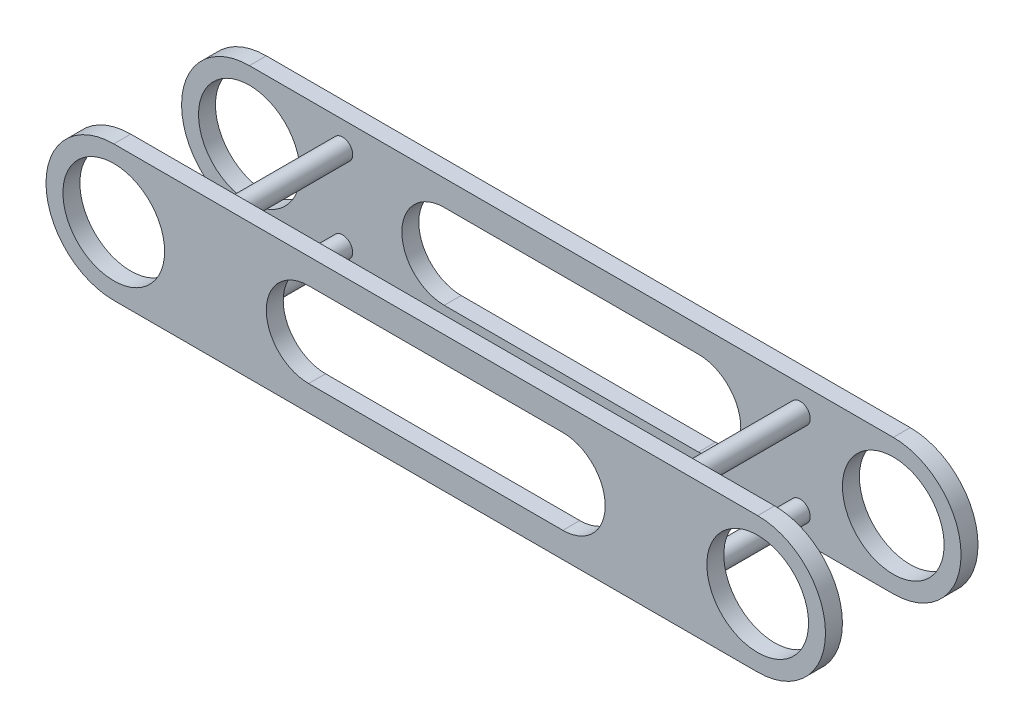
ISO-10303-21;
HEADER;
FILE_DESCRIPTION(('STEP AP214'),'2;1');
FILE_NAME('part.step','',(''),(''),'','','');
FILE_SCHEMA(('AUTOMOTIVE_DESIGN { 1 0 10303 214 1 1 1 1 }'));
ENDSEC;
DATA;
#1=APPLICATION_CONTEXT('core data for automotive mechanical design processes');
#2=APPLICATION_PROTOCOL_DEFINITION('international standard','automotive_design',2000,#1);
#3=PRODUCT_CONTEXT('',#1,'mechanical');
#4=PRODUCT('Part','Part','',(#3));
#5=PRODUCT_RELATED_PRODUCT_CATEGORY('part','',(#4));
#6=PRODUCT_DEFINITION_FORMATION('','',#4);
#7=PRODUCT_DEFINITION_CONTEXT('part definition',#1,'design');
#8=PRODUCT_DEFINITION('design','',#6,#7);
#9=PRODUCT_DEFINITION_SHAPE('','',#8);
#10=(LENGTH_UNIT() NAMED_UNIT(*) SI_UNIT(.MILLI.,.METRE.));
#11=(NAMED_UNIT(*) PLANE_ANGLE_UNIT() SI_UNIT($,.RADIAN.));
#12=(NAMED_UNIT(*) SI_UNIT($,.STERADIAN.) SOLID_ANGLE_UNIT());
#13=UNCERTAINTY_MEASURE_WITH_UNIT(LENGTH_MEASURE(1.E-05),#10,'distance_accuracy_value','');
#14=(GEOMETRIC_REPRESENTATION_CONTEXT(3) GLOBAL_UNCERTAINTY_ASSIGNED_CONTEXT((#13)) GLOBAL_UNIT_ASSIGNED_CONTEXT((#10,
#11,#12)) REPRESENTATION_CONTEXT('',''));
#15=CARTESIAN_POINT('',(0.,0.,0.));
#16=DIRECTION('',(0.,0.,1.));
#17=DIRECTION('',(1.,0.,0.));
#18=AXIS2_PLACEMENT_3D('',#15,#16,#17);
#19=CARTESIAN_POINT('',(380.,0.,-35.));
#20=DIRECTION('',(0.,0.,-1.));
#21=DIRECTION('',(1.,0.,0.));
#22=AXIS2_PLACEMENT_3D('',#19,#20,#21);
#23=PLANE('',#22);
#24=CARTESIAN_POINT('',(54.9999999999999,-25.,-35.));
#25=DIRECTION('',(0.,0.,-1.));
#26=DIRECTION('',(-1.,0.,0.));
#27=AXIS2_PLACEMENT_3D('',#24,#25,#26);
#28=CIRCLE('',#27,6.);
#29=CARTESIAN_POINT('',(48.9999999999999,-25.,-35.));
#30=VERTEX_POINT('',#29);
#31=EDGE_CURVE('E443',#30,#30,#28,.F.);
#32=ORIENTED_EDGE('',*,*,#31,.F.);
#33=EDGE_LOOP('',(#32));
#34=FACE_BOUND('',#33,.T.);
#35=CARTESIAN_POINT('',(325.,-25.,-35.));
#36=DIRECTION('',(0.,0.,-1.));
#37=DIRECTION('',(-1.,0.,0.));
#38=AXIS2_PLACEMENT_3D('',#35,#36,#37);
#39=CIRCLE('',#38,5.99999999999999);
#40=CARTESIAN_POINT('',(319.,-25.,-35.));
#41=VERTEX_POINT('',#40);
#42=EDGE_CURVE('E449',#41,#41,#39,.F.);
#43=ORIENTED_EDGE('',*,*,#42,.F.);
#44=EDGE_LOOP('',(#43));
#45=FACE_BOUND('',#44,.T.);
#46=CARTESIAN_POINT('',(325.,25.,-35.));
#47=DIRECTION('',(0.,0.,-1.));
#48=DIRECTION('',(-1.,0.,0.));
#49=AXIS2_PLACEMENT_3D('',#46,#47,#48);
#50=CIRCLE('',#49,5.99999999999999);
#51=CARTESIAN_POINT('',(319.,25.,-35.));
#52=VERTEX_POINT('',#51);
#53=EDGE_CURVE('E444',#52,#52,#50,.F.);
#54=ORIENTED_EDGE('',*,*,#53,.F.);
#55=EDGE_LOOP('',(#54));
#56=FACE_BOUND('',#55,.T.);
#57=CARTESIAN_POINT('',(54.9999999999999,25.,-35.));
#58=DIRECTION('',(0.,0.,-1.));
#59=DIRECTION('',(-1.,0.,0.));
#60=AXIS2_PLACEMENT_3D('',#57,#58,#59);
#61=CIRCLE('',#60,6.);
#62=CARTESIAN_POINT('',(48.9999999999999,25.,-35.));
#63=VERTEX_POINT('',#62);
#64=EDGE_CURVE('E448',#63,#63,#61,.F.);
#65=ORIENTED_EDGE('',*,*,#64,.F.);
#66=EDGE_LOOP('',(#65));
#67=FACE_BOUND('',#66,.T.);
#68=CARTESIAN_POINT('',(380.,0.,-35.));
#69=DIRECTION('',(0.,0.,1.));
#70=DIRECTION('',(1.,0.,0.));
#71=AXIS2_PLACEMENT_3D('',#68,#69,#70);
#72=CIRCLE('',#71,40.);
#73=CARTESIAN_POINT('',(380.,-40.,-35.));
#74=VERTEX_POINT('',#73);
#75=CARTESIAN_POINT('',(380.,40.,-35.));
#76=VERTEX_POINT('',#75);
#77=EDGE_CURVE('E208',#74,#76,#72,.T.);
#78=ORIENTED_EDGE('',*,*,#77,.T.);
#79=DIRECTION('',(-1.,0.,0.));
#80=VECTOR('',#79,1.);
#81=CARTESIAN_POINT('',(0.,40.,-35.));
#82=LINE('',#81,#80);
#83=CARTESIAN_POINT('',(0.,40.,-35.));
#84=VERTEX_POINT('',#83);
#85=EDGE_CURVE('E219',#76,#84,#82,.T.);
#86=ORIENTED_EDGE('',*,*,#85,.T.);
#87=CARTESIAN_POINT('',(0.,0.,-35.));
#88=DIRECTION('',(0.,0.,1.));
#89=DIRECTION('',(1.,0.,0.));
#90=AXIS2_PLACEMENT_3D('',#87,#88,#89);
#91=CIRCLE('',#90,40.);
#92=CARTESIAN_POINT('',(0.,-40.,-35.));
#93=VERTEX_POINT('',#92);
#94=EDGE_CURVE('E216',#84,#93,#91,.T.);
#95=ORIENTED_EDGE('',*,*,#94,.T.);
#96=DIRECTION('',(1.,0.,0.));
#97=VECTOR('',#96,1.);
#98=CARTESIAN_POINT('',(0.,-40.,-35.));
#99=LINE('',#98,#97);
#100=EDGE_CURVE('E212',#93,#74,#99,.T.);
#101=ORIENTED_EDGE('',*,*,#100,.T.);
#102=EDGE_LOOP('',(#78,#86,#95,#101));
#103=FACE_BOUND('',#102,.T.);
#104=CARTESIAN_POINT('',(380.,0.,-35.));
#105=DIRECTION('',(0.,0.,-1.));
#106=DIRECTION('',(-1.,0.,0.));
#107=AXIS2_PLACEMENT_3D('',#104,#105,#106);
#108=CIRCLE('',#107,30.);
#109=CARTESIAN_POINT('',(350.,0.,-35.));
#110=VERTEX_POINT('',#109);
#111=EDGE_CURVE('E424',#110,#110,#108,.T.);
#112=ORIENTED_EDGE('',*,*,#111,.T.);
#113=EDGE_LOOP('',(#112));
#114=FACE_BOUND('',#113,.T.);
#115=CARTESIAN_POINT('',(0.,0.,-35.));
#116=DIRECTION('',(0.,0.,-1.));
#117=DIRECTION('',(-1.,0.,0.));
#118=AXIS2_PLACEMENT_3D('',#115,#116,#117);
#119=CIRCLE('',#118,30.);
#120=CARTESIAN_POINT('',(-30.,0.,-35.));
#121=VERTEX_POINT('',#120);
#122=EDGE_CURVE('E439',#121,#121,#119,.T.);
#123=ORIENTED_EDGE('',*,*,#122,.T.);
#124=EDGE_LOOP('',(#123));
#125=FACE_BOUND('',#124,.T.);
#126=CARTESIAN_POINT('',(265.,0.,-35.));
#127=DIRECTION('',(0.,0.,-1.));
#128=DIRECTION('',(-1.,0.,0.));
#129=AXIS2_PLACEMENT_3D('',#126,#127,#128);
#130=CIRCLE('',#129,25.);
#131=CARTESIAN_POINT('',(265.,-25.,-35.));
#132=VERTEX_POINT('',#131);
#133=CARTESIAN_POINT('',(265.,25.,-35.));
#134=VERTEX_POINT('',#133);
#135=EDGE_CURVE('E204',#132,#134,#130,.F.);
#136=ORIENTED_EDGE('',*,*,#135,.F.);
#137=DIRECTION('',(1.,0.,0.));
#138=VECTOR('',#137,1.);
#139=CARTESIAN_POINT('',(380.,-25.,-35.));
#140=LINE('',#139,#138);
#141=CARTESIAN_POINT('',(115.,-25.,-35.));
#142=VERTEX_POINT('',#141);
#143=EDGE_CURVE('E192',#142,#132,#140,.T.);
#144=ORIENTED_EDGE('',*,*,#143,.F.);
#145=CARTESIAN_POINT('',(115.,0.,-35.));
#146=DIRECTION('',(0.,0.,-1.));
#147=DIRECTION('',(-1.,0.,0.));
#148=AXIS2_PLACEMENT_3D('',#145,#146,#147);
#149=CIRCLE('',#148,25.);
#150=CARTESIAN_POINT('',(115.,25.,-35.));
#151=VERTEX_POINT('',#150);
#152=EDGE_CURVE('E168',#151,#142,#149,.F.);
#153=ORIENTED_EDGE('',*,*,#152,.F.);
#154=DIRECTION('',(-1.,0.,0.));
#155=VECTOR('',#154,1.);
#156=CARTESIAN_POINT('',(380.,25.,-35.));
#157=LINE('',#156,#155);
#158=EDGE_CURVE('E201',#134,#151,#157,.T.);
#159=ORIENTED_EDGE('',*,*,#158,.F.);
#160=EDGE_LOOP('',(#136,#144,#153,#159));
#161=FACE_BOUND('',#160,.T.);
#162=ADVANCED_FACE('F47',(#34,#45,#56,#67,#103,#114,#125,#161),#23,.F.);
#163=CARTESIAN_POINT('',(380.,0.,-45.));
#164=DIRECTION('',(0.,0.,-1.));
#165=DIRECTION('',(1.,0.,0.));
#166=AXIS2_PLACEMENT_3D('',#163,#164,#165);
#167=PLANE('',#166);
#168=CARTESIAN_POINT('',(0.,0.,-45.));
#169=DIRECTION('',(0.,0.,-1.));
#170=DIRECTION('',(-1.,0.,0.));
#171=AXIS2_PLACEMENT_3D('',#168,#169,#170);
#172=CIRCLE('',#171,30.);
#173=CARTESIAN_POINT('',(-30.,0.,-45.));
#174=VERTEX_POINT('',#173);
#175=EDGE_CURVE('E429',#174,#174,#172,.T.);
#176=ORIENTED_EDGE('',*,*,#175,.F.);
#177=EDGE_LOOP('',(#176));
#178=FACE_BOUND('',#177,.T.);
#179=CARTESIAN_POINT('',(380.,0.,-45.));
#180=DIRECTION('',(0.,0.,-1.));
#181=DIRECTION('',(-1.,0.,0.));
#182=AXIS2_PLACEMENT_3D('',#179,#180,#181);
#183=CIRCLE('',#182,30.);
#184=CARTESIAN_POINT('',(350.,0.,-45.));
#185=VERTEX_POINT('',#184);
#186=EDGE_CURVE('E432',#185,#185,#183,.T.);
#187=ORIENTED_EDGE('',*,*,#186,.F.);
#188=EDGE_LOOP('',(#187));
#189=FACE_BOUND('',#188,.T.);
#190=CARTESIAN_POINT('',(380.,0.,-45.));
#191=DIRECTION('',(0.,0.,1.));
#192=DIRECTION('',(1.,0.,0.));
#193=AXIS2_PLACEMENT_3D('',#190,#191,#192);
#194=CIRCLE('',#193,40.);
#195=CARTESIAN_POINT('',(380.,-40.,-45.));
#196=VERTEX_POINT('',#195);
#197=CARTESIAN_POINT('',(380.,40.,-45.));
#198=VERTEX_POINT('',#197);
#199=EDGE_CURVE('E207',#196,#198,#194,.T.);
#200=ORIENTED_EDGE('',*,*,#199,.F.);
#201=DIRECTION('',(1.,0.,0.));
#202=VECTOR('',#201,1.);
#203=CARTESIAN_POINT('',(0.,-40.,-45.));
#204=LINE('',#203,#202);
#205=CARTESIAN_POINT('',(0.,-40.,-45.));
#206=VERTEX_POINT('',#205);
#207=EDGE_CURVE('E226',#206,#196,#204,.T.);
#208=ORIENTED_EDGE('',*,*,#207,.F.);
#209=CARTESIAN_POINT('',(0.,0.,-45.));
#210=DIRECTION('',(0.,0.,1.));
#211=DIRECTION('',(1.,0.,0.));
#212=AXIS2_PLACEMENT_3D('',#209,#210,#211);
#213=CIRCLE('',#212,40.);
#214=CARTESIAN_POINT('',(0.,40.,-45.));
#215=VERTEX_POINT('',#214);
#216=EDGE_CURVE('E229',#215,#206,#213,.T.);
#217=ORIENTED_EDGE('',*,*,#216,.F.);
#218=DIRECTION('',(-1.,0.,0.));
#219=VECTOR('',#218,1.);
#220=CARTESIAN_POINT('',(0.,40.,-45.));
#221=LINE('',#220,#219);
#222=EDGE_CURVE('E213',#198,#215,#221,.T.);
#223=ORIENTED_EDGE('',*,*,#222,.F.);
#224=EDGE_LOOP('',(#200,#208,#217,#223));
#225=FACE_BOUND('',#224,.T.);
#226=DIRECTION('',(1.,0.,0.));
#227=VECTOR('',#226,1.);
#228=CARTESIAN_POINT('',(265.,-25.,-45.));
#229=LINE('',#228,#227);
#230=CARTESIAN_POINT('',(115.,-25.,-45.));
#231=VERTEX_POINT('',#230);
#232=CARTESIAN_POINT('',(265.,-25.,-45.));
#233=VERTEX_POINT('',#232);
#234=EDGE_CURVE('E175',#231,#233,#229,.T.);
#235=ORIENTED_EDGE('',*,*,#234,.T.);
#236=CARTESIAN_POINT('',(265.,0.,-45.));
#237=DIRECTION('',(0.,0.,1.));
#238=DIRECTION('',(1.,0.,0.));
#239=AXIS2_PLACEMENT_3D('',#236,#237,#238);
#240=CIRCLE('',#239,25.);
#241=CARTESIAN_POINT('',(265.,25.,-45.));
#242=VERTEX_POINT('',#241);
#243=EDGE_CURVE('E73',#233,#242,#240,.T.);
#244=ORIENTED_EDGE('',*,*,#243,.T.);
#245=DIRECTION('',(-1.,0.,0.));
#246=VECTOR('',#245,1.);
#247=CARTESIAN_POINT('',(265.,25.,-45.));
#248=LINE('',#247,#246);
#249=CARTESIAN_POINT('',(115.,25.,-45.));
#250=VERTEX_POINT('',#249);
#251=EDGE_CURVE('E182',#242,#250,#248,.T.);
#252=ORIENTED_EDGE('',*,*,#251,.T.);
#253=CARTESIAN_POINT('',(115.,0.,-45.));
#254=DIRECTION('',(0.,0.,1.));
#255=DIRECTION('',(1.,0.,0.));
#256=AXIS2_PLACEMENT_3D('',#253,#254,#255);
#257=CIRCLE('',#256,25.);
#258=EDGE_CURVE('E165',#250,#231,#257,.T.);
#259=ORIENTED_EDGE('',*,*,#258,.T.);
#260=EDGE_LOOP('',(#235,#244,#252,#259));
#261=FACE_BOUND('',#260,.T.);
#262=ADVANCED_FACE('F180',(#178,#189,#225,#261),#167,.T.);
#263=CARTESIAN_POINT('',(380.,0.,35.));
#264=DIRECTION('',(0.,0.,1.));
#265=DIRECTION('',(1.,0.,0.));
#266=AXIS2_PLACEMENT_3D('',#263,#264,#265);
#267=CYLINDRICAL_SURFACE('',#266,40.);
#268=CARTESIAN_POINT('',(380.,0.,45.));
#269=DIRECTION('',(0.,0.,1.));
#270=DIRECTION('',(1.,0.,0.));
#271=AXIS2_PLACEMENT_3D('',#268,#269,#270);
#272=CIRCLE('',#271,40.);
#273=CARTESIAN_POINT('',(380.,-40.,45.));
#274=VERTEX_POINT('',#273);
#275=CARTESIAN_POINT('',(380.,40.,45.));
#276=VERTEX_POINT('',#275);
#277=EDGE_CURVE('E293',#274,#276,#272,.T.);
#278=ORIENTED_EDGE('',*,*,#277,.F.);
#279=DIRECTION('',(0.,0.,1.));
#280=VECTOR('',#279,1.);
#281=CARTESIAN_POINT('',(380.,-40.,35.));
#282=LINE('',#281,#280);
#283=CARTESIAN_POINT('',(380.,-40.,35.));
#284=VERTEX_POINT('',#283);
#285=EDGE_CURVE('E11',#284,#274,#282,.T.);
#286=ORIENTED_EDGE('',*,*,#285,.F.);
#287=CARTESIAN_POINT('',(380.,0.,35.));
#288=DIRECTION('',(0.,0.,1.));
#289=DIRECTION('',(1.,0.,0.));
#290=AXIS2_PLACEMENT_3D('',#287,#288,#289);
#291=CIRCLE('',#290,40.);
#292=CARTESIAN_POINT('',(380.,40.,35.));
#293=VERTEX_POINT('',#292);
#294=EDGE_CURVE('E294',#284,#293,#291,.T.);
#295=ORIENTED_EDGE('',*,*,#294,.T.);
#296=DIRECTION('',(0.,0.,1.));
#297=VECTOR('',#296,1.);
#298=CARTESIAN_POINT('',(380.,40.,35.));
#299=LINE('',#298,#297);
#300=EDGE_CURVE('E51',#293,#276,#299,.T.);
#301=ORIENTED_EDGE('',*,*,#300,.T.);
#302=EDGE_LOOP('',(#278,#286,#295,#301));
#303=FACE_BOUND('',#302,.T.);
#304=ADVANCED_FACE('F49',(#303),#267,.T.);
#305=CARTESIAN_POINT('',(0.,-40.,35.));
#306=DIRECTION('',(0.,-1.,0.));
#307=DIRECTION('',(0.,0.,-1.));
#308=AXIS2_PLACEMENT_3D('',#305,#306,#307);
#309=PLANE('',#308);
#310=DIRECTION('',(1.,0.,0.));
#311=VECTOR('',#310,1.);
#312=CARTESIAN_POINT('',(0.,-40.,45.));
#313=LINE('',#312,#311);
#314=CARTESIAN_POINT('',(0.,-40.,45.));
#315=VERTEX_POINT('',#314);
#316=EDGE_CURVE('E299',#315,#274,#313,.T.);
#317=ORIENTED_EDGE('',*,*,#316,.F.);
#318=DIRECTION('',(0.,0.,1.));
#319=VECTOR('',#318,1.);
#320=CARTESIAN_POINT('',(0.,-40.,35.));
#321=LINE('',#320,#319);
#322=CARTESIAN_POINT('',(0.,-40.,35.));
#323=VERTEX_POINT('',#322);
#324=EDGE_CURVE('E57',#323,#315,#321,.T.);
#325=ORIENTED_EDGE('',*,*,#324,.F.);
#326=DIRECTION('',(1.,0.,0.));
#327=VECTOR('',#326,1.);
#328=CARTESIAN_POINT('',(0.,-40.,35.));
#329=LINE('',#328,#327);
#330=EDGE_CURVE('E307',#323,#284,#329,.T.);
#331=ORIENTED_EDGE('',*,*,#330,.T.);
#332=ORIENTED_EDGE('',*,*,#285,.T.);
#333=EDGE_LOOP('',(#317,#325,#331,#332));
#334=FACE_BOUND('',#333,.T.);
#335=ADVANCED_FACE('F341',(#334),#309,.T.);
#336=CARTESIAN_POINT('',(0.,0.,35.));
#337=DIRECTION('',(0.,0.,1.));
#338=DIRECTION('',(1.,0.,0.));
#339=AXIS2_PLACEMENT_3D('',#336,#337,#338);
#340=CYLINDRICAL_SURFACE('',#339,40.);
#341=CARTESIAN_POINT('',(0.,0.,45.));
#342=DIRECTION('',(0.,0.,1.));
#343=DIRECTION('',(1.,0.,0.));
#344=AXIS2_PLACEMENT_3D('',#341,#342,#343);
#345=CIRCLE('',#344,40.);
#346=CARTESIAN_POINT('',(0.,40.,45.));
#347=VERTEX_POINT('',#346);
#348=EDGE_CURVE('E318',#347,#315,#345,.T.);
#349=ORIENTED_EDGE('',*,*,#348,.F.);
#350=DIRECTION('',(0.,0.,1.));
#351=VECTOR('',#350,1.);
#352=CARTESIAN_POINT('',(0.,40.,35.));
#353=LINE('',#352,#351);
#354=CARTESIAN_POINT('',(0.,40.,35.));
#355=VERTEX_POINT('',#354);
#356=EDGE_CURVE('E326',#355,#347,#353,.T.);
#357=ORIENTED_EDGE('',*,*,#356,.F.);
#358=CARTESIAN_POINT('',(0.,0.,35.));
#359=DIRECTION('',(0.,0.,1.));
#360=DIRECTION('',(1.,0.,0.));
#361=AXIS2_PLACEMENT_3D('',#358,#359,#360);
#362=CIRCLE('',#361,40.);
#363=EDGE_CURVE('E303',#355,#323,#362,.T.);
#364=ORIENTED_EDGE('',*,*,#363,.T.);
#365=ORIENTED_EDGE('',*,*,#324,.T.);
#366=EDGE_LOOP('',(#349,#357,#364,#365));
#367=FACE_BOUND('',#366,.T.);
#368=ADVANCED_FACE('F347',(#367),#340,.T.);
#369=CARTESIAN_POINT('',(0.,40.,35.));
#370=DIRECTION('',(0.,1.,0.));
#371=DIRECTION('',(0.,0.,1.));
#372=AXIS2_PLACEMENT_3D('',#369,#370,#371);
#373=PLANE('',#372);
#374=DIRECTION('',(-1.,0.,0.));
#375=VECTOR('',#374,1.);
#376=CARTESIAN_POINT('',(0.,40.,45.));
#377=LINE('',#376,#375);
#378=EDGE_CURVE('E314',#276,#347,#377,.T.);
#379=ORIENTED_EDGE('',*,*,#378,.F.);
#380=ORIENTED_EDGE('',*,*,#300,.F.);
#381=DIRECTION('',(-1.,0.,0.));
#382=VECTOR('',#381,1.);
#383=CARTESIAN_POINT('',(0.,40.,35.));
#384=LINE('',#383,#382);
#385=EDGE_CURVE('E298',#293,#355,#384,.T.);
#386=ORIENTED_EDGE('',*,*,#385,.T.);
#387=ORIENTED_EDGE('',*,*,#356,.T.);
#388=EDGE_LOOP('',(#379,#380,#386,#387));
#389=FACE_BOUND('',#388,.T.);
#390=ADVANCED_FACE('F336',(#389),#373,.T.);
#391=CARTESIAN_POINT('',(380.,0.,35.));
#392=DIRECTION('',(0.,0.,1.));
#393=DIRECTION('',(1.,0.,0.));
#394=AXIS2_PLACEMENT_3D('',#391,#392,#393);
#395=PLANE('',#394);
#396=CARTESIAN_POINT('',(54.9999999999999,-25.,35.));
#397=DIRECTION('',(0.,0.,1.));
#398=DIRECTION('',(1.,0.,0.));
#399=AXIS2_PLACEMENT_3D('',#396,#397,#398);
#400=CIRCLE('',#399,6.);
#401=CARTESIAN_POINT('',(60.9999999999999,-25.,35.));
#402=VERTEX_POINT('',#401);
#403=EDGE_CURVE('E471',#402,#402,#400,.T.);
#404=ORIENTED_EDGE('',*,*,#403,.T.);
#405=EDGE_LOOP('',(#404));
#406=FACE_BOUND('',#405,.T.);
#407=CARTESIAN_POINT('',(325.,-25.,35.));
#408=DIRECTION('',(0.,0.,1.));
#409=DIRECTION('',(1.,0.,0.));
#410=AXIS2_PLACEMENT_3D('',#407,#408,#409);
#411=CIRCLE('',#410,5.99999999999999);
#412=CARTESIAN_POINT('',(331.,-25.,35.));
#413=VERTEX_POINT('',#412);
#414=EDGE_CURVE('E467',#413,#413,#411,.T.);
#415=ORIENTED_EDGE('',*,*,#414,.T.);
#416=EDGE_LOOP('',(#415));
#417=FACE_BOUND('',#416,.T.);
#418=CARTESIAN_POINT('',(325.,25.,35.));
#419=DIRECTION('',(0.,0.,1.));
#420=DIRECTION('',(1.,0.,0.));
#421=AXIS2_PLACEMENT_3D('',#418,#419,#420);
#422=CIRCLE('',#421,5.99999999999999);
#423=CARTESIAN_POINT('',(331.,25.,35.));
#424=VERTEX_POINT('',#423);
#425=EDGE_CURVE('E463',#424,#424,#422,.T.);
#426=ORIENTED_EDGE('',*,*,#425,.T.);
#427=EDGE_LOOP('',(#426));
#428=FACE_BOUND('',#427,.T.);
#429=CARTESIAN_POINT('',(54.9999999999999,25.,35.));
#430=DIRECTION('',(0.,0.,1.));
#431=DIRECTION('',(1.,0.,0.));
#432=AXIS2_PLACEMENT_3D('',#429,#430,#431);
#433=CIRCLE('',#432,6.);
#434=CARTESIAN_POINT('',(60.9999999999999,25.,35.));
#435=VERTEX_POINT('',#434);
#436=EDGE_CURVE('E459',#435,#435,#433,.T.);
#437=ORIENTED_EDGE('',*,*,#436,.T.);
#438=EDGE_LOOP('',(#437));
#439=FACE_BOUND('',#438,.T.);
#440=CARTESIAN_POINT('',(380.,0.,35.));
#441=DIRECTION('',(0.,0.,1.));
#442=DIRECTION('',(1.,0.,0.));
#443=AXIS2_PLACEMENT_3D('',#440,#441,#442);
#444=CIRCLE('',#443,30.);
#445=CARTESIAN_POINT('',(410.,0.,35.));
#446=VERTEX_POINT('',#445);
#447=EDGE_CURVE('E700',#446,#446,#444,.T.);
#448=ORIENTED_EDGE('',*,*,#447,.T.);
#449=EDGE_LOOP('',(#448));
#450=FACE_BOUND('',#449,.T.);
#451=DIRECTION('',(1.,0.,0.));
#452=VECTOR('',#451,1.);
#453=CARTESIAN_POINT('',(380.,-25.,35.));
#454=LINE('',#453,#452);
#455=CARTESIAN_POINT('',(115.,-25.,35.));
#456=VERTEX_POINT('',#455);
#457=CARTESIAN_POINT('',(265.,-25.,35.));
#458=VERTEX_POINT('',#457);
#459=EDGE_CURVE('E285',#456,#458,#454,.T.);
#460=ORIENTED_EDGE('',*,*,#459,.T.);
#461=CARTESIAN_POINT('',(265.,0.,35.));
#462=DIRECTION('',(0.,0.,1.));
#463=DIRECTION('',(1.,0.,0.));
#464=AXIS2_PLACEMENT_3D('',#461,#462,#463);
#465=CIRCLE('',#464,25.);
#466=CARTESIAN_POINT('',(265.,25.,35.));
#467=VERTEX_POINT('',#466);
#468=EDGE_CURVE('E289',#458,#467,#465,.T.);
#469=ORIENTED_EDGE('',*,*,#468,.T.);
#470=DIRECTION('',(-1.,0.,0.));
#471=VECTOR('',#470,1.);
#472=CARTESIAN_POINT('',(380.,25.,35.));
#473=LINE('',#472,#471);
#474=CARTESIAN_POINT('',(115.,25.,35.));
#475=VERTEX_POINT('',#474);
#476=EDGE_CURVE('E268',#467,#475,#473,.T.);
#477=ORIENTED_EDGE('',*,*,#476,.T.);
#478=CARTESIAN_POINT('',(115.,0.,35.));
#479=DIRECTION('',(0.,0.,1.));
#480=DIRECTION('',(1.,0.,0.));
#481=AXIS2_PLACEMENT_3D('',#478,#479,#480);
#482=CIRCLE('',#481,25.);
#483=EDGE_CURVE('E281',#475,#456,#482,.T.);
#484=ORIENTED_EDGE('',*,*,#483,.T.);
#485=EDGE_LOOP('',(#460,#469,#477,#484));
#486=FACE_BOUND('',#485,.T.);
#487=CARTESIAN_POINT('',(0.,0.,35.));
#488=DIRECTION('',(0.,0.,1.));
#489=DIRECTION('',(1.,0.,0.));
#490=AXIS2_PLACEMENT_3D('',#487,#488,#489);
#491=CIRCLE('',#490,30.);
#492=CARTESIAN_POINT('',(30.,0.,35.));
#493=VERTEX_POINT('',#492);
#494=EDGE_CURVE('E423',#493,#493,#491,.T.);
#495=ORIENTED_EDGE('',*,*,#494,.T.);
#496=EDGE_LOOP('',(#495));
#497=FACE_BOUND('',#496,.T.);
#498=ORIENTED_EDGE('',*,*,#294,.F.);
#499=ORIENTED_EDGE('',*,*,#330,.F.);
#500=ORIENTED_EDGE('',*,*,#363,.F.);
#501=ORIENTED_EDGE('',*,*,#385,.F.);
#502=EDGE_LOOP('',(#498,#499,#500,#501));
#503=FACE_BOUND('',#502,.T.);
#504=ADVANCED_FACE('F344',(#406,#417,#428,#439,#450,#486,#497,#503),#395,.F.);
#505=CARTESIAN_POINT('',(380.,0.,45.));
#506=DIRECTION('',(0.,0.,1.));
#507=DIRECTION('',(1.,0.,0.));
#508=AXIS2_PLACEMENT_3D('',#505,#506,#507);
#509=PLANE('',#508);
#510=CARTESIAN_POINT('',(380.,0.,45.));
#511=DIRECTION('',(0.,0.,1.));
#512=DIRECTION('',(1.,0.,0.));
#513=AXIS2_PLACEMENT_3D('',#510,#511,#512);
#514=CIRCLE('',#513,30.);
#515=CARTESIAN_POINT('',(410.,0.,45.));
#516=VERTEX_POINT('',#515);
#517=EDGE_CURVE('E413',#516,#516,#514,.T.);
#518=ORIENTED_EDGE('',*,*,#517,.F.);
#519=EDGE_LOOP('',(#518));
#520=FACE_BOUND('',#519,.T.);
#521=CARTESIAN_POINT('',(265.,0.,45.));
#522=DIRECTION('',(0.,0.,1.));
#523=DIRECTION('',(1.,0.,0.));
#524=AXIS2_PLACEMENT_3D('',#521,#522,#523);
#525=CIRCLE('',#524,25.);
#526=CARTESIAN_POINT('',(265.,-25.,45.));
#527=VERTEX_POINT('',#526);
#528=CARTESIAN_POINT('',(265.,25.,45.));
#529=VERTEX_POINT('',#528);
#530=EDGE_CURVE('E238',#527,#529,#525,.T.);
#531=ORIENTED_EDGE('',*,*,#530,.F.);
#532=DIRECTION('',(1.,0.,0.));
#533=VECTOR('',#532,1.);
#534=CARTESIAN_POINT('',(265.,-25.,45.));
#535=LINE('',#534,#533);
#536=CARTESIAN_POINT('',(115.,-25.,45.));
#537=VERTEX_POINT('',#536);
#538=EDGE_CURVE('E260',#537,#527,#535,.T.);
#539=ORIENTED_EDGE('',*,*,#538,.F.);
#540=CARTESIAN_POINT('',(115.,0.,45.));
#541=DIRECTION('',(0.,0.,1.));
#542=DIRECTION('',(1.,0.,0.));
#543=AXIS2_PLACEMENT_3D('',#540,#541,#542);
#544=CIRCLE('',#543,25.);
#545=CARTESIAN_POINT('',(115.,25.,45.));
#546=VERTEX_POINT('',#545);
#547=EDGE_CURVE('E256',#546,#537,#544,.T.);
#548=ORIENTED_EDGE('',*,*,#547,.F.);
#549=DIRECTION('',(-1.,0.,0.));
#550=VECTOR('',#549,1.);
#551=CARTESIAN_POINT('',(265.,25.,45.));
#552=LINE('',#551,#550);
#553=EDGE_CURVE('E252',#529,#546,#552,.T.);
#554=ORIENTED_EDGE('',*,*,#553,.F.);
#555=EDGE_LOOP('',(#531,#539,#548,#554));
#556=FACE_BOUND('',#555,.T.);
#557=CARTESIAN_POINT('',(0.,0.,45.));
#558=DIRECTION('',(0.,0.,1.));
#559=DIRECTION('',(1.,0.,0.));
#560=AXIS2_PLACEMENT_3D('',#557,#558,#559);
#561=CIRCLE('',#560,30.);
#562=CARTESIAN_POINT('',(30.,0.,45.));
#563=VERTEX_POINT('',#562);
#564=EDGE_CURVE('E420',#563,#563,#561,.T.);
#565=ORIENTED_EDGE('',*,*,#564,.F.);
#566=EDGE_LOOP('',(#565));
#567=FACE_BOUND('',#566,.T.);
#568=ORIENTED_EDGE('',*,*,#277,.T.);
#569=ORIENTED_EDGE('',*,*,#378,.T.);
#570=ORIENTED_EDGE('',*,*,#348,.T.);
#571=ORIENTED_EDGE('',*,*,#316,.T.);
#572=EDGE_LOOP('',(#568,#569,#570,#571));
#573=FACE_BOUND('',#572,.T.);
#574=ADVANCED_FACE('F338',(#520,#556,#567,#573),#509,.T.);
#575=CARTESIAN_POINT('',(265.,0.,-52.5));
#576=DIRECTION('',(0.,0.,1.));
#577=DIRECTION('',(1.,0.,0.));
#578=AXIS2_PLACEMENT_3D('',#575,#576,#577);
#579=CYLINDRICAL_SURFACE('',#578,25.);
#580=DIRECTION('',(0.,0.,1.));
#581=VECTOR('',#580,1.);
#582=CARTESIAN_POINT('',(265.,-25.,-52.5));
#583=LINE('',#582,#581);
#584=EDGE_CURVE('E265',#458,#527,#583,.T.);
#585=ORIENTED_EDGE('',*,*,#584,.T.);
#586=ORIENTED_EDGE('',*,*,#530,.T.);
#587=DIRECTION('',(0.,0.,1.));
#588=VECTOR('',#587,1.);
#589=CARTESIAN_POINT('',(265.,25.,-52.5));
#590=LINE('',#589,#588);
#591=EDGE_CURVE('E264',#467,#529,#590,.T.);
#592=ORIENTED_EDGE('',*,*,#591,.F.);
#593=ORIENTED_EDGE('',*,*,#468,.F.);
#594=EDGE_LOOP('',(#585,#586,#592,#593));
#595=FACE_BOUND('',#594,.T.);
#596=ADVANCED_FACE('F392',(#595),#579,.F.);
#597=CARTESIAN_POINT('',(265.,-25.,-52.5));
#598=DIRECTION('',(0.,-1.,0.));
#599=DIRECTION('',(1.,0.,0.));
#600=AXIS2_PLACEMENT_3D('',#597,#598,#599);
#601=PLANE('',#600);
#602=DIRECTION('',(0.,0.,1.));
#603=VECTOR('',#602,1.);
#604=CARTESIAN_POINT('',(115.,-25.,-52.5));
#605=LINE('',#604,#603);
#606=EDGE_CURVE('E269',#456,#537,#605,.T.);
#607=ORIENTED_EDGE('',*,*,#606,.T.);
#608=ORIENTED_EDGE('',*,*,#538,.T.);
#609=ORIENTED_EDGE('',*,*,#584,.F.);
#610=ORIENTED_EDGE('',*,*,#459,.F.);
#611=EDGE_LOOP('',(#607,#608,#609,#610));
#612=FACE_BOUND('',#611,.T.);
#613=ADVANCED_FACE('F388',(#612),#601,.F.);
#614=CARTESIAN_POINT('',(115.,0.,-52.5));
#615=DIRECTION('',(0.,0.,1.));
#616=DIRECTION('',(1.,0.,0.));
#617=AXIS2_PLACEMENT_3D('',#614,#615,#616);
#618=CYLINDRICAL_SURFACE('',#617,25.);
#619=DIRECTION('',(0.,0.,1.));
#620=VECTOR('',#619,1.);
#621=CARTESIAN_POINT('',(115.,25.,-52.5));
#622=LINE('',#621,#620);
#623=EDGE_CURVE('E272',#475,#546,#622,.T.);
#624=ORIENTED_EDGE('',*,*,#623,.T.);
#625=ORIENTED_EDGE('',*,*,#547,.T.);
#626=ORIENTED_EDGE('',*,*,#606,.F.);
#627=ORIENTED_EDGE('',*,*,#483,.F.);
#628=EDGE_LOOP('',(#624,#625,#626,#627));
#629=FACE_BOUND('',#628,.T.);
#630=ADVANCED_FACE('F391',(#629),#618,.F.);
#631=CARTESIAN_POINT('',(265.,25.,-52.5));
#632=DIRECTION('',(0.,1.,0.));
#633=DIRECTION('',(-1.,0.,0.));
#634=AXIS2_PLACEMENT_3D('',#631,#632,#633);
#635=PLANE('',#634);
#636=ORIENTED_EDGE('',*,*,#591,.T.);
#637=ORIENTED_EDGE('',*,*,#553,.T.);
#638=ORIENTED_EDGE('',*,*,#623,.F.);
#639=ORIENTED_EDGE('',*,*,#476,.F.);
#640=EDGE_LOOP('',(#636,#637,#638,#639));
#641=FACE_BOUND('',#640,.T.);
#642=ADVANCED_FACE('F386',(#641),#635,.F.);
#643=CARTESIAN_POINT('',(380.,0.,-35.));
#644=DIRECTION('',(0.,0.,-1.));
#645=DIRECTION('',(-1.,0.,0.));
#646=AXIS2_PLACEMENT_3D('',#643,#644,#645);
#647=CYLINDRICAL_SURFACE('',#646,40.);
#648=ORIENTED_EDGE('',*,*,#199,.T.);
#649=DIRECTION('',(0.,0.,-1.));
#650=VECTOR('',#649,1.);
#651=CARTESIAN_POINT('',(380.,40.,-35.));
#652=LINE('',#651,#650);
#653=EDGE_CURVE('E234',#76,#198,#652,.T.);
#654=ORIENTED_EDGE('',*,*,#653,.F.);
#655=ORIENTED_EDGE('',*,*,#77,.F.);
#656=DIRECTION('',(0.,0.,-1.));
#657=VECTOR('',#656,1.);
#658=CARTESIAN_POINT('',(380.,-40.,-35.));
#659=LINE('',#658,#657);
#660=EDGE_CURVE('E222',#74,#196,#659,.T.);
#661=ORIENTED_EDGE('',*,*,#660,.T.);
#662=EDGE_LOOP('',(#648,#654,#655,#661));
#663=FACE_BOUND('',#662,.T.);
#664=ADVANCED_FACE('F375',(#663),#647,.T.);
#665=CARTESIAN_POINT('',(0.,40.,-35.));
#666=DIRECTION('',(0.,-1.,0.));
#667=DIRECTION('',(0.,0.,-1.));
#668=AXIS2_PLACEMENT_3D('',#665,#666,#667);
#669=PLANE('',#668);
#670=ORIENTED_EDGE('',*,*,#222,.T.);
#671=DIRECTION('',(0.,0.,-1.));
#672=VECTOR('',#671,1.);
#673=CARTESIAN_POINT('',(0.,40.,-35.));
#674=LINE('',#673,#672);
#675=EDGE_CURVE('E239',#84,#215,#674,.T.);
#676=ORIENTED_EDGE('',*,*,#675,.F.);
#677=ORIENTED_EDGE('',*,*,#85,.F.);
#678=ORIENTED_EDGE('',*,*,#653,.T.);
#679=EDGE_LOOP('',(#670,#676,#677,#678));
#680=FACE_BOUND('',#679,.T.);
#681=ADVANCED_FACE('F371',(#680),#669,.F.);
#682=CARTESIAN_POINT('',(0.,0.,-35.));
#683=DIRECTION('',(0.,0.,-1.));
#684=DIRECTION('',(-1.,0.,0.));
#685=AXIS2_PLACEMENT_3D('',#682,#683,#684);
#686=CYLINDRICAL_SURFACE('',#685,40.);
#687=ORIENTED_EDGE('',*,*,#216,.T.);
#688=DIRECTION('',(0.,0.,-1.));
#689=VECTOR('',#688,1.);
#690=CARTESIAN_POINT('',(0.,-40.,-35.));
#691=LINE('',#690,#689);
#692=EDGE_CURVE('E243',#93,#206,#691,.T.);
#693=ORIENTED_EDGE('',*,*,#692,.F.);
#694=ORIENTED_EDGE('',*,*,#94,.F.);
#695=ORIENTED_EDGE('',*,*,#675,.T.);
#696=EDGE_LOOP('',(#687,#693,#694,#695));
#697=FACE_BOUND('',#696,.T.);
#698=ADVANCED_FACE('F374',(#697),#686,.T.);
#699=CARTESIAN_POINT('',(0.,-40.,-35.));
#700=DIRECTION('',(0.,1.,0.));
#701=DIRECTION('',(0.,0.,1.));
#702=AXIS2_PLACEMENT_3D('',#699,#700,#701);
#703=PLANE('',#702);
#704=ORIENTED_EDGE('',*,*,#207,.T.);
#705=ORIENTED_EDGE('',*,*,#660,.F.);
#706=ORIENTED_EDGE('',*,*,#100,.F.);
#707=ORIENTED_EDGE('',*,*,#692,.T.);
#708=EDGE_LOOP('',(#704,#705,#706,#707));
#709=FACE_BOUND('',#708,.T.);
#710=ADVANCED_FACE('F379',(#709),#703,.F.);
#711=CARTESIAN_POINT('',(265.,0.,52.5));
#712=DIRECTION('',(0.,0.,-1.));
#713=DIRECTION('',(-1.,0.,0.));
#714=AXIS2_PLACEMENT_3D('',#711,#712,#713);
#715=CYLINDRICAL_SURFACE('',#714,25.);
#716=ORIENTED_EDGE('',*,*,#135,.T.);
#717=DIRECTION('',(0.,0.,-1.));
#718=VECTOR('',#717,1.);
#719=CARTESIAN_POINT('',(265.,25.,52.5));
#720=LINE('',#719,#718);
#721=EDGE_CURVE('E189',#134,#242,#720,.T.);
#722=ORIENTED_EDGE('',*,*,#721,.T.);
#723=ORIENTED_EDGE('',*,*,#243,.F.);
#724=DIRECTION('',(0.,0.,-1.));
#725=VECTOR('',#724,1.);
#726=CARTESIAN_POINT('',(265.,-25.,52.5));
#727=LINE('',#726,#725);
#728=EDGE_CURVE('E172',#132,#233,#727,.T.);
#729=ORIENTED_EDGE('',*,*,#728,.F.);
#730=EDGE_LOOP('',(#716,#722,#723,#729));
#731=FACE_BOUND('',#730,.T.);
#732=ADVANCED_FACE('F368',(#731),#715,.F.);
#733=CARTESIAN_POINT('',(265.,25.,52.5));
#734=DIRECTION('',(0.,-1.,0.));
#735=DIRECTION('',(1.,0.,0.));
#736=AXIS2_PLACEMENT_3D('',#733,#734,#735);
#737=PLANE('',#736);
#738=ORIENTED_EDGE('',*,*,#158,.T.);
#739=DIRECTION('',(0.,0.,-1.));
#740=VECTOR('',#739,1.);
#741=CARTESIAN_POINT('',(115.,25.,52.5));
#742=LINE('',#741,#740);
#743=EDGE_CURVE('E171',#151,#250,#742,.T.);
#744=ORIENTED_EDGE('',*,*,#743,.T.);
#745=ORIENTED_EDGE('',*,*,#251,.F.);
#746=ORIENTED_EDGE('',*,*,#721,.F.);
#747=EDGE_LOOP('',(#738,#744,#745,#746));
#748=FACE_BOUND('',#747,.T.);
#749=ADVANCED_FACE('F500',(#748),#737,.T.);
#750=CARTESIAN_POINT('',(115.,0.,52.5));
#751=DIRECTION('',(0.,0.,-1.));
#752=DIRECTION('',(-1.,0.,0.));
#753=AXIS2_PLACEMENT_3D('',#750,#751,#752);
#754=CYLINDRICAL_SURFACE('',#753,25.);
#755=ORIENTED_EDGE('',*,*,#152,.T.);
#756=DIRECTION('',(0.,0.,-1.));
#757=VECTOR('',#756,1.);
#758=CARTESIAN_POINT('',(115.,-25.,52.5));
#759=LINE('',#758,#757);
#760=EDGE_CURVE('E65',#142,#231,#759,.T.);
#761=ORIENTED_EDGE('',*,*,#760,.T.);
#762=ORIENTED_EDGE('',*,*,#258,.F.);
#763=ORIENTED_EDGE('',*,*,#743,.F.);
#764=EDGE_LOOP('',(#755,#761,#762,#763));
#765=FACE_BOUND('',#764,.T.);
#766=ADVANCED_FACE('F162',(#765),#754,.F.);
#767=CARTESIAN_POINT('',(265.,-25.,52.5));
#768=DIRECTION('',(0.,1.,0.));
#769=DIRECTION('',(-1.,0.,0.));
#770=AXIS2_PLACEMENT_3D('',#767,#768,#769);
#771=PLANE('',#770);
#772=ORIENTED_EDGE('',*,*,#143,.T.);
#773=ORIENTED_EDGE('',*,*,#728,.T.);
#774=ORIENTED_EDGE('',*,*,#234,.F.);
#775=ORIENTED_EDGE('',*,*,#760,.F.);
#776=EDGE_LOOP('',(#772,#773,#774,#775));
#777=FACE_BOUND('',#776,.T.);
#778=ADVANCED_FACE('F176',(#777),#771,.T.);
#779=CARTESIAN_POINT('',(54.9999999999999,25.,-51.9705627484771));
#780=DIRECTION('',(0.,0.,1.));
#781=DIRECTION('',(1.,0.,0.));
#782=AXIS2_PLACEMENT_3D('',#779,#780,#781);
#783=CYLINDRICAL_SURFACE('',#782,6.);
#784=ORIENTED_EDGE('',*,*,#64,.T.);
#785=EDGE_LOOP('',(#784));
#786=FACE_BOUND('',#785,.T.);
#787=ORIENTED_EDGE('',*,*,#436,.F.);
#788=EDGE_LOOP('',(#787));
#789=FACE_BOUND('',#788,.T.);
#790=ADVANCED_FACE('F497',(#786,#789),#783,.T.);
#791=CARTESIAN_POINT('',(325.,25.,-51.9705627484771));
#792=DIRECTION('',(0.,0.,1.));
#793=DIRECTION('',(1.,0.,0.));
#794=AXIS2_PLACEMENT_3D('',#791,#792,#793);
#795=CYLINDRICAL_SURFACE('',#794,5.99999999999999);
#796=ORIENTED_EDGE('',*,*,#53,.T.);
#797=EDGE_LOOP('',(#796));
#798=FACE_BOUND('',#797,.T.);
#799=ORIENTED_EDGE('',*,*,#425,.F.);
#800=EDGE_LOOP('',(#799));
#801=FACE_BOUND('',#800,.T.);
#802=ADVANCED_FACE('F492',(#798,#801),#795,.T.);
#803=CARTESIAN_POINT('',(325.,-25.,-51.9705627484771));
#804=DIRECTION('',(0.,0.,1.));
#805=DIRECTION('',(1.,0.,0.));
#806=AXIS2_PLACEMENT_3D('',#803,#804,#805);
#807=CYLINDRICAL_SURFACE('',#806,5.99999999999999);
#808=ORIENTED_EDGE('',*,*,#42,.T.);
#809=EDGE_LOOP('',(#808));
#810=FACE_BOUND('',#809,.T.);
#811=ORIENTED_EDGE('',*,*,#414,.F.);
#812=EDGE_LOOP('',(#811));
#813=FACE_BOUND('',#812,.T.);
#814=ADVANCED_FACE('F481',(#810,#813),#807,.T.);
#815=CARTESIAN_POINT('',(54.9999999999999,-25.,-51.9705627484771));
#816=DIRECTION('',(0.,0.,1.));
#817=DIRECTION('',(1.,0.,0.));
#818=AXIS2_PLACEMENT_3D('',#815,#816,#817);
#819=CYLINDRICAL_SURFACE('',#818,6.);
#820=ORIENTED_EDGE('',*,*,#31,.T.);
#821=EDGE_LOOP('',(#820));
#822=FACE_BOUND('',#821,.T.);
#823=ORIENTED_EDGE('',*,*,#403,.F.);
#824=EDGE_LOOP('',(#823));
#825=FACE_BOUND('',#824,.T.);
#826=ADVANCED_FACE('F478',(#822,#825),#819,.T.);
#827=CARTESIAN_POINT('',(380.,0.,-52.5));
#828=DIRECTION('',(0.,0.,1.));
#829=DIRECTION('',(1.,0.,0.));
#830=AXIS2_PLACEMENT_3D('',#827,#828,#829);
#831=CYLINDRICAL_SURFACE('',#830,30.);
#832=ORIENTED_EDGE('',*,*,#517,.T.);
#833=EDGE_LOOP('',(#832));
#834=FACE_BOUND('',#833,.T.);
#835=ORIENTED_EDGE('',*,*,#447,.F.);
#836=EDGE_LOOP('',(#835));
#837=FACE_BOUND('',#836,.T.);
#838=ADVANCED_FACE('F480',(#834,#837),#831,.F.);
#839=CARTESIAN_POINT('',(0.,0.,-52.5));
#840=DIRECTION('',(0.,0.,1.));
#841=DIRECTION('',(1.,0.,0.));
#842=AXIS2_PLACEMENT_3D('',#839,#840,#841);
#843=CYLINDRICAL_SURFACE('',#842,30.);
#844=ORIENTED_EDGE('',*,*,#564,.T.);
#845=EDGE_LOOP('',(#844));
#846=FACE_BOUND('',#845,.T.);
#847=ORIENTED_EDGE('',*,*,#494,.F.);
#848=EDGE_LOOP('',(#847));
#849=FACE_BOUND('',#848,.T.);
#850=ADVANCED_FACE('F488',(#846,#849),#843,.F.);
#851=ORIENTED_EDGE('',*,*,#186,.T.);
#852=EDGE_LOOP('',(#851));
#853=FACE_BOUND('',#852,.T.);
#854=ORIENTED_EDGE('',*,*,#111,.F.);
#855=EDGE_LOOP('',(#854));
#856=FACE_BOUND('',#855,.T.);
#857=ADVANCED_FACE('F491',(#853,#856),#831,.F.);
#858=ORIENTED_EDGE('',*,*,#175,.T.);
#859=EDGE_LOOP('',(#858));
#860=FACE_BOUND('',#859,.T.);
#861=ORIENTED_EDGE('',*,*,#122,.F.);
#862=EDGE_LOOP('',(#861));
#863=FACE_BOUND('',#862,.T.);
#864=ADVANCED_FACE('F653',(#860,#863),#843,.F.);
#865=CLOSED_SHELL('',(#162,#262,#304,#335,#368,#390,#504,#574,#596,#613,#630,#642,#664,#681,
#698,#710,#732,#749,#766,#778,#790,#802,#814,#826,#838,#850,#857,#864));
#866=MANIFOLD_SOLID_BREP('B2',#865);
#867=ADVANCED_BREP_SHAPE_REPRESENTATION('',(#18,#866),#14);
#868=SHAPE_DEFINITION_REPRESENTATION(#9,#867);
ENDSEC;
END-ISO-10303-21;
